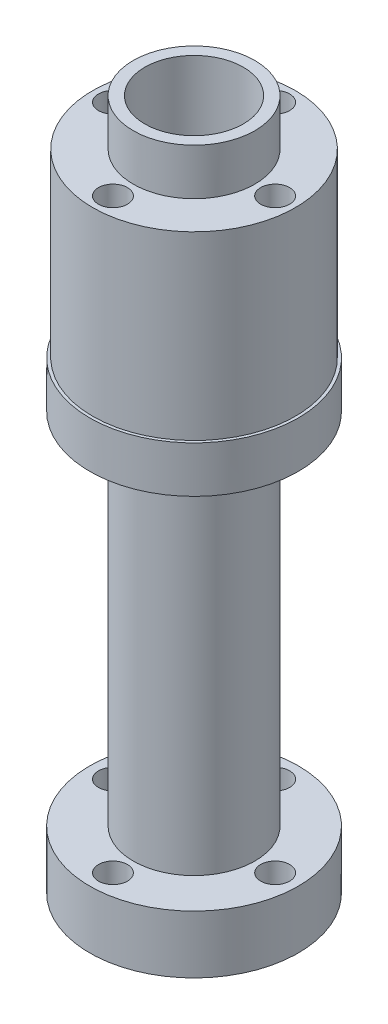
ISO-10303-21;
HEADER;
FILE_DESCRIPTION(('STEP AP214'),'2;1');
FILE_NAME('part.step','',(''),(''),'','','');
FILE_SCHEMA(('AUTOMOTIVE_DESIGN { 1 0 10303 214 1 1 1 1 }'));
ENDSEC;
DATA;
#1=APPLICATION_CONTEXT('core data for automotive mechanical design processes');
#2=APPLICATION_PROTOCOL_DEFINITION('international standard','automotive_design',2000,#1);
#3=PRODUCT_CONTEXT('',#1,'mechanical');
#4=PRODUCT('Part','Part','',(#3));
#5=PRODUCT_RELATED_PRODUCT_CATEGORY('part','',(#4));
#6=PRODUCT_DEFINITION_FORMATION('','',#4);
#7=PRODUCT_DEFINITION_CONTEXT('part definition',#1,'design');
#8=PRODUCT_DEFINITION('design','',#6,#7);
#9=PRODUCT_DEFINITION_SHAPE('','',#8);
#10=(LENGTH_UNIT() NAMED_UNIT(*) SI_UNIT(.MILLI.,.METRE.));
#11=(NAMED_UNIT(*) PLANE_ANGLE_UNIT() SI_UNIT($,.RADIAN.));
#12=(NAMED_UNIT(*) SI_UNIT($,.STERADIAN.) SOLID_ANGLE_UNIT());
#13=UNCERTAINTY_MEASURE_WITH_UNIT(LENGTH_MEASURE(1.E-05),#10,'distance_accuracy_value','');
#14=(GEOMETRIC_REPRESENTATION_CONTEXT(3) GLOBAL_UNCERTAINTY_ASSIGNED_CONTEXT((#13)) GLOBAL_UNIT_ASSIGNED_CONTEXT((#10,
#11,#12)) REPRESENTATION_CONTEXT('',''));
#15=CARTESIAN_POINT('',(0.,0.,0.));
#16=DIRECTION('',(0.,0.,1.));
#17=DIRECTION('',(1.,0.,0.));
#18=AXIS2_PLACEMENT_3D('',#15,#16,#17);
#19=CARTESIAN_POINT('',(-4.25,55.6,0.));
#20=DIRECTION('',(0.,-1.,0.));
#21=DIRECTION('',(0.,0.,-1.));
#22=AXIS2_PLACEMENT_3D('',#19,#20,#21);
#23=PLANE('',#22);
#24=CARTESIAN_POINT('',(0.,55.6,0.));
#25=DIRECTION('',(0.,1.,0.));
#26=DIRECTION('',(0.,0.,1.));
#27=AXIS2_PLACEMENT_3D('',#24,#25,#26);
#28=CIRCLE('',#27,8.75);
#29=CARTESIAN_POINT('',(0.,55.6,8.75));
#30=VERTEX_POINT('',#29);
#31=EDGE_CURVE('E68',#30,#30,#28,.T.);
#32=ORIENTED_EDGE('',*,*,#31,.T.);
#33=EDGE_LOOP('',(#32));
#34=FACE_BOUND('',#33,.T.);
#35=CARTESIAN_POINT('',(0.,55.6,-7.));
#36=DIRECTION('',(0.,1.,0.));
#37=DIRECTION('',(0.,0.,1.));
#38=AXIS2_PLACEMENT_3D('',#35,#36,#37);
#39=CIRCLE('',#38,1.25);
#40=CARTESIAN_POINT('',(0.,55.6,-5.75));
#41=VERTEX_POINT('',#40);
#42=EDGE_CURVE('E102',#41,#41,#39,.T.);
#43=ORIENTED_EDGE('',*,*,#42,.F.);
#44=EDGE_LOOP('',(#43));
#45=FACE_BOUND('',#44,.T.);
#46=CARTESIAN_POINT('',(0.,55.6,7.));
#47=DIRECTION('',(0.,1.,0.));
#48=DIRECTION('',(0.,0.,1.));
#49=AXIS2_PLACEMENT_3D('',#46,#47,#48);
#50=CIRCLE('',#49,1.25);
#51=CARTESIAN_POINT('',(0.,55.6,8.25));
#52=VERTEX_POINT('',#51);
#53=EDGE_CURVE('E108',#52,#52,#50,.T.);
#54=ORIENTED_EDGE('',*,*,#53,.F.);
#55=EDGE_LOOP('',(#54));
#56=FACE_BOUND('',#55,.T.);
#57=CARTESIAN_POINT('',(-7.,55.6,0.));
#58=DIRECTION('',(0.,1.,0.));
#59=DIRECTION('',(0.,0.,1.));
#60=AXIS2_PLACEMENT_3D('',#57,#58,#59);
#61=CIRCLE('',#60,1.25);
#62=CARTESIAN_POINT('',(-7.,55.6,1.25));
#63=VERTEX_POINT('',#62);
#64=EDGE_CURVE('E114',#63,#63,#61,.T.);
#65=ORIENTED_EDGE('',*,*,#64,.F.);
#66=EDGE_LOOP('',(#65));
#67=FACE_BOUND('',#66,.T.);
#68=CARTESIAN_POINT('',(7.,55.6,0.));
#69=DIRECTION('',(0.,1.,0.));
#70=DIRECTION('',(0.,0.,1.));
#71=AXIS2_PLACEMENT_3D('',#68,#69,#70);
#72=CIRCLE('',#71,1.25);
#73=CARTESIAN_POINT('',(7.,55.6,1.25));
#74=VERTEX_POINT('',#73);
#75=EDGE_CURVE('E97',#74,#74,#72,.T.);
#76=ORIENTED_EDGE('',*,*,#75,.F.);
#77=EDGE_LOOP('',(#76));
#78=FACE_BOUND('',#77,.T.);
#79=CARTESIAN_POINT('',(0.,55.6,0.));
#80=DIRECTION('',(0.,-1.,0.));
#81=DIRECTION('',(0.,0.,-1.));
#82=AXIS2_PLACEMENT_3D('',#79,#80,#81);
#83=CIRCLE('',#82,5.25);
#84=CARTESIAN_POINT('',(0.,55.6,-5.25));
#85=VERTEX_POINT('',#84);
#86=EDGE_CURVE('E12',#85,#85,#83,.F.);
#87=ORIENTED_EDGE('',*,*,#86,.F.);
#88=EDGE_LOOP('',(#87));
#89=FACE_BOUND('',#88,.T.);
#90=ADVANCED_FACE('F39',(#34,#45,#56,#67,#78,#89),#23,.F.);
#91=CARTESIAN_POINT('',(0.,0.,0.));
#92=DIRECTION('',(0.,-1.,0.));
#93=DIRECTION('',(0.,0.,-1.));
#94=AXIS2_PLACEMENT_3D('',#91,#92,#93);
#95=CYLINDRICAL_SURFACE('',#94,9.);
#96=CARTESIAN_POINT('',(0.,36.,0.));
#97=DIRECTION('',(0.,-1.,0.));
#98=DIRECTION('',(0.,0.,-1.));
#99=AXIS2_PLACEMENT_3D('',#96,#97,#98);
#100=CIRCLE('',#99,9.);
#101=CARTESIAN_POINT('',(0.,36.,-9.));
#102=VERTEX_POINT('',#101);
#103=EDGE_CURVE('E46',#102,#102,#100,.T.);
#104=ORIENTED_EDGE('',*,*,#103,.F.);
#105=EDGE_LOOP('',(#104));
#106=FACE_BOUND('',#105,.T.);
#107=CARTESIAN_POINT('',(0.,40.,0.));
#108=DIRECTION('',(0.,1.,0.));
#109=DIRECTION('',(0.,0.,1.));
#110=AXIS2_PLACEMENT_3D('',#107,#108,#109);
#111=CIRCLE('',#110,9.);
#112=CARTESIAN_POINT('',(0.,40.,9.));
#113=VERTEX_POINT('',#112);
#114=EDGE_CURVE('E58',#113,#113,#111,.T.);
#115=ORIENTED_EDGE('',*,*,#114,.F.);
#116=EDGE_LOOP('',(#115));
#117=FACE_BOUND('',#116,.T.);
#118=ADVANCED_FACE('F146',(#106,#117),#95,.T.);
#119=CARTESIAN_POINT('',(0.,0.,0.));
#120=DIRECTION('',(0.,-1.,0.));
#121=DIRECTION('',(0.,0.,-1.));
#122=AXIS2_PLACEMENT_3D('',#119,#120,#121);
#123=CYLINDRICAL_SURFACE('',#122,4.25);
#124=CARTESIAN_POINT('',(0.,0.,0.));
#125=DIRECTION('',(0.,-1.,0.));
#126=DIRECTION('',(0.,0.,-1.));
#127=AXIS2_PLACEMENT_3D('',#124,#125,#126);
#128=CIRCLE('',#127,4.25);
#129=CARTESIAN_POINT('',(0.,0.,-4.25));
#130=VERTEX_POINT('',#129);
#131=EDGE_CURVE('E101',#130,#130,#128,.T.);
#132=ORIENTED_EDGE('',*,*,#131,.T.);
#133=EDGE_LOOP('',(#132));
#134=FACE_BOUND('',#133,.T.);
#135=CARTESIAN_POINT('',(0.,59.6,0.));
#136=DIRECTION('',(0.,1.,0.));
#137=DIRECTION('',(0.,0.,1.));
#138=AXIS2_PLACEMENT_3D('',#135,#136,#137);
#139=CIRCLE('',#138,4.25);
#140=CARTESIAN_POINT('',(0.,59.6,4.25));
#141=VERTEX_POINT('',#140);
#142=EDGE_CURVE('E371',#141,#141,#139,.T.);
#143=ORIENTED_EDGE('',*,*,#142,.T.);
#144=EDGE_LOOP('',(#143));
#145=FACE_BOUND('',#144,.T.);
#146=ADVANCED_FACE('F41',(#134,#145),#123,.F.);
#147=CARTESIAN_POINT('',(-9.,36.,0.));
#148=DIRECTION('',(0.,1.,0.));
#149=DIRECTION('',(0.,0.,1.));
#150=AXIS2_PLACEMENT_3D('',#147,#148,#149);
#151=PLANE('',#150);
#152=CARTESIAN_POINT('',(0.,36.,0.));
#153=DIRECTION('',(0.,-1.,0.));
#154=DIRECTION('',(0.,0.,-1.));
#155=AXIS2_PLACEMENT_3D('',#152,#153,#154);
#156=CIRCLE('',#155,5.25);
#157=CARTESIAN_POINT('',(0.,36.,-5.25));
#158=VERTEX_POINT('',#157);
#159=EDGE_CURVE('E50',#158,#158,#156,.T.);
#160=ORIENTED_EDGE('',*,*,#159,.F.);
#161=EDGE_LOOP('',(#160));
#162=FACE_BOUND('',#161,.T.);
#163=ORIENTED_EDGE('',*,*,#103,.T.);
#164=EDGE_LOOP('',(#163));
#165=FACE_BOUND('',#164,.T.);
#166=ADVANCED_FACE('F137',(#162,#165),#151,.F.);
#167=CARTESIAN_POINT('',(0.,0.,0.));
#168=DIRECTION('',(0.,-1.,0.));
#169=DIRECTION('',(0.,0.,-1.));
#170=AXIS2_PLACEMENT_3D('',#167,#168,#169);
#171=CYLINDRICAL_SURFACE('',#170,5.25);
#172=CARTESIAN_POINT('',(0.,5.,0.));
#173=DIRECTION('',(0.,-1.,0.));
#174=DIRECTION('',(0.,0.,-1.));
#175=AXIS2_PLACEMENT_3D('',#172,#173,#174);
#176=CIRCLE('',#175,5.25);
#177=CARTESIAN_POINT('',(0.,5.,-5.25));
#178=VERTEX_POINT('',#177);
#179=EDGE_CURVE('E55',#178,#178,#176,.T.);
#180=ORIENTED_EDGE('',*,*,#179,.F.);
#181=EDGE_LOOP('',(#180));
#182=FACE_BOUND('',#181,.T.);
#183=ORIENTED_EDGE('',*,*,#159,.T.);
#184=EDGE_LOOP('',(#183));
#185=FACE_BOUND('',#184,.T.);
#186=ADVANCED_FACE('F134',(#182,#185),#171,.T.);
#187=CARTESIAN_POINT('',(-5.25,5.,0.));
#188=DIRECTION('',(0.,-1.,0.));
#189=DIRECTION('',(0.,0.,-1.));
#190=AXIS2_PLACEMENT_3D('',#187,#188,#189);
#191=PLANE('',#190);
#192=CARTESIAN_POINT('',(0.,5.,-7.));
#193=DIRECTION('',(0.,-1.,0.));
#194=DIRECTION('',(0.,0.,-1.));
#195=AXIS2_PLACEMENT_3D('',#192,#193,#194);
#196=CIRCLE('',#195,1.25);
#197=CARTESIAN_POINT('',(0.,5.,-8.25));
#198=VERTEX_POINT('',#197);
#199=EDGE_CURVE('E94',#198,#198,#196,.F.);
#200=ORIENTED_EDGE('',*,*,#199,.F.);
#201=EDGE_LOOP('',(#200));
#202=FACE_BOUND('',#201,.T.);
#203=CARTESIAN_POINT('',(0.,5.,7.));
#204=DIRECTION('',(0.,-1.,0.));
#205=DIRECTION('',(0.,0.,-1.));
#206=AXIS2_PLACEMENT_3D('',#203,#204,#205);
#207=CIRCLE('',#206,1.25);
#208=CARTESIAN_POINT('',(0.,5.,5.75));
#209=VERTEX_POINT('',#208);
#210=EDGE_CURVE('E91',#209,#209,#207,.F.);
#211=ORIENTED_EDGE('',*,*,#210,.F.);
#212=EDGE_LOOP('',(#211));
#213=FACE_BOUND('',#212,.T.);
#214=CARTESIAN_POINT('',(-7.,5.,0.));
#215=DIRECTION('',(0.,-1.,0.));
#216=DIRECTION('',(0.,0.,-1.));
#217=AXIS2_PLACEMENT_3D('',#214,#215,#216);
#218=CIRCLE('',#217,1.25);
#219=CARTESIAN_POINT('',(-7.,5.,-1.25));
#220=VERTEX_POINT('',#219);
#221=EDGE_CURVE('E88',#220,#220,#218,.F.);
#222=ORIENTED_EDGE('',*,*,#221,.F.);
#223=EDGE_LOOP('',(#222));
#224=FACE_BOUND('',#223,.T.);
#225=CARTESIAN_POINT('',(7.,5.,0.));
#226=DIRECTION('',(0.,-1.,0.));
#227=DIRECTION('',(0.,0.,-1.));
#228=AXIS2_PLACEMENT_3D('',#225,#226,#227);
#229=CIRCLE('',#228,1.25);
#230=CARTESIAN_POINT('',(7.,5.,-1.25));
#231=VERTEX_POINT('',#230);
#232=EDGE_CURVE('E80',#231,#231,#229,.F.);
#233=ORIENTED_EDGE('',*,*,#232,.F.);
#234=EDGE_LOOP('',(#233));
#235=FACE_BOUND('',#234,.T.);
#236=CARTESIAN_POINT('',(0.,5.,0.));
#237=DIRECTION('',(0.,-1.,0.));
#238=DIRECTION('',(0.,0.,-1.));
#239=AXIS2_PLACEMENT_3D('',#236,#237,#238);
#240=CIRCLE('',#239,9.);
#241=CARTESIAN_POINT('',(0.,5.,-9.));
#242=VERTEX_POINT('',#241);
#243=EDGE_CURVE('E127',#242,#242,#240,.T.);
#244=ORIENTED_EDGE('',*,*,#243,.F.);
#245=EDGE_LOOP('',(#244));
#246=FACE_BOUND('',#245,.T.);
#247=ORIENTED_EDGE('',*,*,#179,.T.);
#248=EDGE_LOOP('',(#247));
#249=FACE_BOUND('',#248,.T.);
#250=ADVANCED_FACE('F132',(#202,#213,#224,#235,#246,#249),#191,.F.);
#251=CARTESIAN_POINT('',(0.,0.,0.));
#252=DIRECTION('',(0.,-1.,0.));
#253=DIRECTION('',(0.,0.,-1.));
#254=AXIS2_PLACEMENT_3D('',#251,#252,#253);
#255=CYLINDRICAL_SURFACE('',#254,9.);
#256=CARTESIAN_POINT('',(0.,0.,0.));
#257=DIRECTION('',(0.,-1.,0.));
#258=DIRECTION('',(0.,0.,-1.));
#259=AXIS2_PLACEMENT_3D('',#256,#257,#258);
#260=CIRCLE('',#259,9.);
#261=CARTESIAN_POINT('',(0.,0.,-9.));
#262=VERTEX_POINT('',#261);
#263=EDGE_CURVE('E124',#262,#262,#260,.T.);
#264=ORIENTED_EDGE('',*,*,#263,.F.);
#265=EDGE_LOOP('',(#264));
#266=FACE_BOUND('',#265,.T.);
#267=ORIENTED_EDGE('',*,*,#243,.T.);
#268=EDGE_LOOP('',(#267));
#269=FACE_BOUND('',#268,.T.);
#270=ADVANCED_FACE('F179',(#266,#269),#255,.T.);
#271=CARTESIAN_POINT('',(-4.25,0.,0.));
#272=DIRECTION('',(0.,1.,0.));
#273=DIRECTION('',(0.,0.,1.));
#274=AXIS2_PLACEMENT_3D('',#271,#272,#273);
#275=PLANE('',#274);
#276=CARTESIAN_POINT('',(0.,0.,-7.));
#277=DIRECTION('',(0.,1.,0.));
#278=DIRECTION('',(0.,0.,1.));
#279=AXIS2_PLACEMENT_3D('',#276,#277,#278);
#280=CIRCLE('',#279,1.25);
#281=CARTESIAN_POINT('',(0.,0.,-5.75));
#282=VERTEX_POINT('',#281);
#283=EDGE_CURVE('E77',#282,#282,#280,.T.);
#284=ORIENTED_EDGE('',*,*,#283,.T.);
#285=EDGE_LOOP('',(#284));
#286=FACE_BOUND('',#285,.T.);
#287=CARTESIAN_POINT('',(0.,0.,7.));
#288=DIRECTION('',(0.,1.,0.));
#289=DIRECTION('',(0.,0.,1.));
#290=AXIS2_PLACEMENT_3D('',#287,#288,#289);
#291=CIRCLE('',#290,1.25);
#292=CARTESIAN_POINT('',(0.,0.,8.25));
#293=VERTEX_POINT('',#292);
#294=EDGE_CURVE('E81',#293,#293,#291,.T.);
#295=ORIENTED_EDGE('',*,*,#294,.T.);
#296=EDGE_LOOP('',(#295));
#297=FACE_BOUND('',#296,.T.);
#298=CARTESIAN_POINT('',(-7.,0.,0.));
#299=DIRECTION('',(0.,1.,0.));
#300=DIRECTION('',(0.,0.,1.));
#301=AXIS2_PLACEMENT_3D('',#298,#299,#300);
#302=CIRCLE('',#301,1.25);
#303=CARTESIAN_POINT('',(-7.,0.,1.25));
#304=VERTEX_POINT('',#303);
#305=EDGE_CURVE('E65',#304,#304,#302,.T.);
#306=ORIENTED_EDGE('',*,*,#305,.T.);
#307=EDGE_LOOP('',(#306));
#308=FACE_BOUND('',#307,.T.);
#309=CARTESIAN_POINT('',(7.,0.,0.));
#310=DIRECTION('',(0.,1.,0.));
#311=DIRECTION('',(0.,0.,1.));
#312=AXIS2_PLACEMENT_3D('',#309,#310,#311);
#313=CIRCLE('',#312,1.25);
#314=CARTESIAN_POINT('',(7.,0.,1.25));
#315=VERTEX_POINT('',#314);
#316=EDGE_CURVE('E60',#315,#315,#313,.T.);
#317=ORIENTED_EDGE('',*,*,#316,.T.);
#318=EDGE_LOOP('',(#317));
#319=FACE_BOUND('',#318,.T.);
#320=ORIENTED_EDGE('',*,*,#131,.F.);
#321=EDGE_LOOP('',(#320));
#322=FACE_BOUND('',#321,.T.);
#323=ORIENTED_EDGE('',*,*,#263,.T.);
#324=EDGE_LOOP('',(#323));
#325=FACE_BOUND('',#324,.T.);
#326=ADVANCED_FACE('F169',(#286,#297,#308,#319,#322,#325),#275,.F.);
#327=CARTESIAN_POINT('',(7.,45.6,0.));
#328=DIRECTION('',(0.,1.,0.));
#329=DIRECTION('',(0.,0.,1.));
#330=AXIS2_PLACEMENT_3D('',#327,#328,#329);
#331=CYLINDRICAL_SURFACE('',#330,1.25);
#332=CARTESIAN_POINT('',(7.,45.6,0.));
#333=DIRECTION('',(0.,1.,0.));
#334=DIRECTION('',(0.,0.,1.));
#335=AXIS2_PLACEMENT_3D('',#332,#333,#334);
#336=CIRCLE('',#335,1.25);
#337=CARTESIAN_POINT('',(7.,45.6,1.25));
#338=VERTEX_POINT('',#337);
#339=EDGE_CURVE('E117',#338,#338,#336,.T.);
#340=ORIENTED_EDGE('',*,*,#339,.F.);
#341=EDGE_LOOP('',(#340));
#342=FACE_BOUND('',#341,.T.);
#343=ORIENTED_EDGE('',*,*,#75,.T.);
#344=EDGE_LOOP('',(#343));
#345=FACE_BOUND('',#344,.T.);
#346=ADVANCED_FACE('F166',(#342,#345),#331,.F.);
#347=CARTESIAN_POINT('',(7.,45.6,0.));
#348=DIRECTION('',(0.,1.,0.));
#349=DIRECTION('',(0.,0.,1.));
#350=AXIS2_PLACEMENT_3D('',#347,#348,#349);
#351=PLANE('',#350);
#352=ORIENTED_EDGE('',*,*,#339,.T.);
#353=EDGE_LOOP('',(#352));
#354=FACE_BOUND('',#353,.T.);
#355=ADVANCED_FACE('F168',(#354),#351,.T.);
#356=CARTESIAN_POINT('',(-7.,45.6,0.));
#357=DIRECTION('',(0.,1.,0.));
#358=DIRECTION('',(0.,0.,1.));
#359=AXIS2_PLACEMENT_3D('',#356,#357,#358);
#360=CYLINDRICAL_SURFACE('',#359,1.25);
#361=CARTESIAN_POINT('',(-7.,45.6,0.));
#362=DIRECTION('',(0.,1.,0.));
#363=DIRECTION('',(0.,0.,1.));
#364=AXIS2_PLACEMENT_3D('',#361,#362,#363);
#365=CIRCLE('',#364,1.25);
#366=CARTESIAN_POINT('',(-7.,45.6,1.25));
#367=VERTEX_POINT('',#366);
#368=EDGE_CURVE('E111',#367,#367,#365,.T.);
#369=ORIENTED_EDGE('',*,*,#368,.F.);
#370=EDGE_LOOP('',(#369));
#371=FACE_BOUND('',#370,.T.);
#372=ORIENTED_EDGE('',*,*,#64,.T.);
#373=EDGE_LOOP('',(#372));
#374=FACE_BOUND('',#373,.T.);
#375=ADVANCED_FACE('F176',(#371,#374),#360,.F.);
#376=CARTESIAN_POINT('',(-7.,45.6,0.));
#377=DIRECTION('',(0.,1.,0.));
#378=DIRECTION('',(0.,0.,1.));
#379=AXIS2_PLACEMENT_3D('',#376,#377,#378);
#380=PLANE('',#379);
#381=ORIENTED_EDGE('',*,*,#368,.T.);
#382=EDGE_LOOP('',(#381));
#383=FACE_BOUND('',#382,.T.);
#384=ADVANCED_FACE('F232',(#383),#380,.T.);
#385=CARTESIAN_POINT('',(0.,45.6,7.));
#386=DIRECTION('',(0.,1.,0.));
#387=DIRECTION('',(0.,0.,1.));
#388=AXIS2_PLACEMENT_3D('',#385,#386,#387);
#389=CYLINDRICAL_SURFACE('',#388,1.25);
#390=CARTESIAN_POINT('',(0.,45.6,7.));
#391=DIRECTION('',(0.,1.,0.));
#392=DIRECTION('',(0.,0.,1.));
#393=AXIS2_PLACEMENT_3D('',#390,#391,#392);
#394=CIRCLE('',#393,1.25);
#395=CARTESIAN_POINT('',(0.,45.6,8.25));
#396=VERTEX_POINT('',#395);
#397=EDGE_CURVE('E105',#396,#396,#394,.T.);
#398=ORIENTED_EDGE('',*,*,#397,.F.);
#399=EDGE_LOOP('',(#398));
#400=FACE_BOUND('',#399,.T.);
#401=ORIENTED_EDGE('',*,*,#53,.T.);
#402=EDGE_LOOP('',(#401));
#403=FACE_BOUND('',#402,.T.);
#404=ADVANCED_FACE('F228',(#400,#403),#389,.F.);
#405=CARTESIAN_POINT('',(0.,45.6,7.));
#406=DIRECTION('',(0.,1.,0.));
#407=DIRECTION('',(0.,0.,1.));
#408=AXIS2_PLACEMENT_3D('',#405,#406,#407);
#409=PLANE('',#408);
#410=ORIENTED_EDGE('',*,*,#397,.T.);
#411=EDGE_LOOP('',(#410));
#412=FACE_BOUND('',#411,.T.);
#413=ADVANCED_FACE('F224',(#412),#409,.T.);
#414=CARTESIAN_POINT('',(0.,45.6,-7.));
#415=DIRECTION('',(0.,1.,0.));
#416=DIRECTION('',(0.,0.,1.));
#417=AXIS2_PLACEMENT_3D('',#414,#415,#416);
#418=CYLINDRICAL_SURFACE('',#417,1.25);
#419=CARTESIAN_POINT('',(0.,45.6,-7.));
#420=DIRECTION('',(0.,1.,0.));
#421=DIRECTION('',(0.,0.,1.));
#422=AXIS2_PLACEMENT_3D('',#419,#420,#421);
#423=CIRCLE('',#422,1.25);
#424=CARTESIAN_POINT('',(0.,45.6,-5.75));
#425=VERTEX_POINT('',#424);
#426=EDGE_CURVE('E98',#425,#425,#423,.T.);
#427=ORIENTED_EDGE('',*,*,#426,.F.);
#428=EDGE_LOOP('',(#427));
#429=FACE_BOUND('',#428,.T.);
#430=ORIENTED_EDGE('',*,*,#42,.T.);
#431=EDGE_LOOP('',(#430));
#432=FACE_BOUND('',#431,.T.);
#433=ADVANCED_FACE('F216',(#429,#432),#418,.F.);
#434=CARTESIAN_POINT('',(0.,45.6,-7.));
#435=DIRECTION('',(0.,1.,0.));
#436=DIRECTION('',(0.,0.,1.));
#437=AXIS2_PLACEMENT_3D('',#434,#435,#436);
#438=PLANE('',#437);
#439=ORIENTED_EDGE('',*,*,#426,.T.);
#440=EDGE_LOOP('',(#439));
#441=FACE_BOUND('',#440,.T.);
#442=ADVANCED_FACE('F206',(#441),#438,.T.);
#443=CARTESIAN_POINT('',(7.,6.,0.));
#444=DIRECTION('',(0.,-1.,0.));
#445=DIRECTION('',(0.,0.,-1.));
#446=AXIS2_PLACEMENT_3D('',#443,#444,#445);
#447=CYLINDRICAL_SURFACE('',#446,1.25);
#448=ORIENTED_EDGE('',*,*,#316,.F.);
#449=EDGE_LOOP('',(#448));
#450=FACE_BOUND('',#449,.T.);
#451=ORIENTED_EDGE('',*,*,#232,.T.);
#452=EDGE_LOOP('',(#451));
#453=FACE_BOUND('',#452,.T.);
#454=ADVANCED_FACE('F203',(#450,#453),#447,.F.);
#455=CARTESIAN_POINT('',(-7.,6.,0.));
#456=DIRECTION('',(0.,-1.,0.));
#457=DIRECTION('',(0.,0.,-1.));
#458=AXIS2_PLACEMENT_3D('',#455,#456,#457);
#459=CYLINDRICAL_SURFACE('',#458,1.25);
#460=ORIENTED_EDGE('',*,*,#305,.F.);
#461=EDGE_LOOP('',(#460));
#462=FACE_BOUND('',#461,.T.);
#463=ORIENTED_EDGE('',*,*,#221,.T.);
#464=EDGE_LOOP('',(#463));
#465=FACE_BOUND('',#464,.T.);
#466=ADVANCED_FACE('F205',(#462,#465),#459,.F.);
#467=CARTESIAN_POINT('',(0.,6.,7.));
#468=DIRECTION('',(0.,-1.,0.));
#469=DIRECTION('',(0.,0.,-1.));
#470=AXIS2_PLACEMENT_3D('',#467,#468,#469);
#471=CYLINDRICAL_SURFACE('',#470,1.25);
#472=ORIENTED_EDGE('',*,*,#294,.F.);
#473=EDGE_LOOP('',(#472));
#474=FACE_BOUND('',#473,.T.);
#475=ORIENTED_EDGE('',*,*,#210,.T.);
#476=EDGE_LOOP('',(#475));
#477=FACE_BOUND('',#476,.T.);
#478=ADVANCED_FACE('F213',(#474,#477),#471,.F.);
#479=CARTESIAN_POINT('',(0.,6.,-7.));
#480=DIRECTION('',(0.,-1.,0.));
#481=DIRECTION('',(0.,0.,-1.));
#482=AXIS2_PLACEMENT_3D('',#479,#480,#481);
#483=CYLINDRICAL_SURFACE('',#482,1.25);
#484=ORIENTED_EDGE('',*,*,#283,.F.);
#485=EDGE_LOOP('',(#484));
#486=FACE_BOUND('',#485,.T.);
#487=ORIENTED_EDGE('',*,*,#199,.T.);
#488=EDGE_LOOP('',(#487));
#489=FACE_BOUND('',#488,.T.);
#490=ADVANCED_FACE('F300',(#486,#489),#483,.F.);
#491=CARTESIAN_POINT('',(-9.,40.,0.));
#492=DIRECTION('',(0.,1.,0.));
#493=DIRECTION('',(0.,0.,1.));
#494=AXIS2_PLACEMENT_3D('',#491,#492,#493);
#495=PLANE('',#494);
#496=CARTESIAN_POINT('',(0.,40.,0.));
#497=DIRECTION('',(0.,1.,0.));
#498=DIRECTION('',(0.,0.,1.));
#499=AXIS2_PLACEMENT_3D('',#496,#497,#498);
#500=CIRCLE('',#499,8.75);
#501=CARTESIAN_POINT('',(0.,40.,8.75));
#502=VERTEX_POINT('',#501);
#503=EDGE_CURVE('E61',#502,#502,#500,.F.);
#504=ORIENTED_EDGE('',*,*,#503,.T.);
#505=EDGE_LOOP('',(#504));
#506=FACE_BOUND('',#505,.T.);
#507=ORIENTED_EDGE('',*,*,#114,.T.);
#508=EDGE_LOOP('',(#507));
#509=FACE_BOUND('',#508,.T.);
#510=ADVANCED_FACE('F309',(#506,#509),#495,.T.);
#511=CARTESIAN_POINT('',(0.,10.2895974360571,0.));
#512=DIRECTION('',(0.,1.,0.));
#513=DIRECTION('',(0.,0.,1.));
#514=AXIS2_PLACEMENT_3D('',#511,#512,#513);
#515=CYLINDRICAL_SURFACE('',#514,8.75);
#516=ORIENTED_EDGE('',*,*,#503,.F.);
#517=EDGE_LOOP('',(#516));
#518=FACE_BOUND('',#517,.T.);
#519=ORIENTED_EDGE('',*,*,#31,.F.);
#520=EDGE_LOOP('',(#519));
#521=FACE_BOUND('',#520,.T.);
#522=ADVANCED_FACE('F325',(#518,#521),#515,.T.);
#523=CARTESIAN_POINT('',(0.,59.6,0.));
#524=DIRECTION('',(0.,1.,0.));
#525=DIRECTION('',(0.,0.,1.));
#526=AXIS2_PLACEMENT_3D('',#523,#524,#525);
#527=PLANE('',#526);
#528=CARTESIAN_POINT('',(0.,59.6,0.));
#529=DIRECTION('',(0.,1.,0.));
#530=DIRECTION('',(0.,0.,1.));
#531=AXIS2_PLACEMENT_3D('',#528,#529,#530);
#532=CIRCLE('',#531,5.25);
#533=CARTESIAN_POINT('',(0.,59.6,5.25));
#534=VERTEX_POINT('',#533);
#535=EDGE_CURVE('E73',#534,#534,#532,.T.);
#536=ORIENTED_EDGE('',*,*,#535,.T.);
#537=EDGE_LOOP('',(#536));
#538=FACE_BOUND('',#537,.T.);
#539=ORIENTED_EDGE('',*,*,#142,.F.);
#540=EDGE_LOOP('',(#539));
#541=FACE_BOUND('',#540,.T.);
#542=ADVANCED_FACE('F333',(#538,#541),#527,.T.);
#543=CARTESIAN_POINT('',(0.,59.6,0.));
#544=DIRECTION('',(0.,-1.,0.));
#545=DIRECTION('',(0.,0.,-1.));
#546=AXIS2_PLACEMENT_3D('',#543,#544,#545);
#547=CYLINDRICAL_SURFACE('',#546,5.25);
#548=ORIENTED_EDGE('',*,*,#535,.F.);
#549=EDGE_LOOP('',(#548));
#550=FACE_BOUND('',#549,.T.);
#551=ORIENTED_EDGE('',*,*,#86,.T.);
#552=EDGE_LOOP('',(#551));
#553=FACE_BOUND('',#552,.T.);
#554=ADVANCED_FACE('F355',(#550,#553),#547,.T.);
#555=CLOSED_SHELL('',(#90,#118,#146,#166,#186,#250,#270,#326,#346,#355,#375,#384,#404,#413,#433,
#442,#454,#466,#478,#490,#510,#522,#542,#554));
#556=MANIFOLD_SOLID_BREP('B2',#555);
#557=ADVANCED_BREP_SHAPE_REPRESENTATION('',(#18,#556),#14);
#558=SHAPE_DEFINITION_REPRESENTATION(#9,#557);
ENDSEC;
END-ISO-10303-21;
